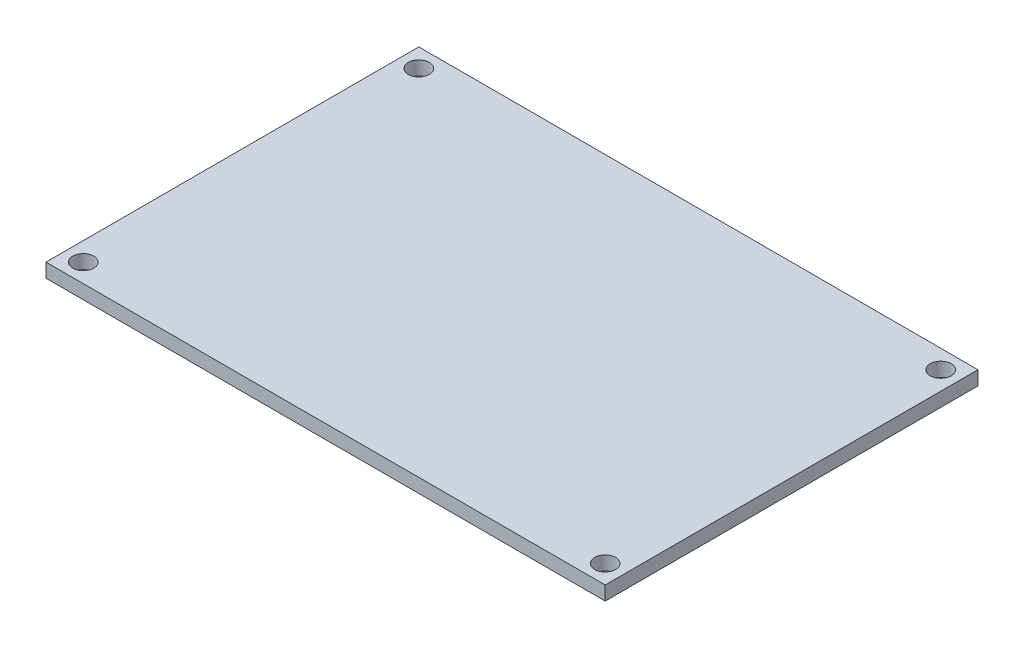
ISO-10303-21;
HEADER;
FILE_DESCRIPTION(('STEP AP214'),'2;1');
FILE_NAME('part.step','',(''),(''),'','','');
FILE_SCHEMA(('AUTOMOTIVE_DESIGN { 1 0 10303 214 1 1 1 1 }'));
ENDSEC;
DATA;
#1=APPLICATION_CONTEXT('core data for automotive mechanical design processes');
#2=APPLICATION_PROTOCOL_DEFINITION('international standard','automotive_design',2000,#1);
#3=PRODUCT_CONTEXT('',#1,'mechanical');
#4=PRODUCT('Part','Part','',(#3));
#5=PRODUCT_RELATED_PRODUCT_CATEGORY('part','',(#4));
#6=PRODUCT_DEFINITION_FORMATION('','',#4);
#7=PRODUCT_DEFINITION_CONTEXT('part definition',#1,'design');
#8=PRODUCT_DEFINITION('design','',#6,#7);
#9=PRODUCT_DEFINITION_SHAPE('','',#8);
#10=(LENGTH_UNIT() NAMED_UNIT(*) SI_UNIT(.MILLI.,.METRE.));
#11=(NAMED_UNIT(*) PLANE_ANGLE_UNIT() SI_UNIT($,.RADIAN.));
#12=(NAMED_UNIT(*) SI_UNIT($,.STERADIAN.) SOLID_ANGLE_UNIT());
#13=UNCERTAINTY_MEASURE_WITH_UNIT(LENGTH_MEASURE(1.E-05),#10,'distance_accuracy_value','');
#14=(GEOMETRIC_REPRESENTATION_CONTEXT(3) GLOBAL_UNCERTAINTY_ASSIGNED_CONTEXT((#13)) GLOBAL_UNIT_ASSIGNED_CONTEXT((#10,
#11,#12)) REPRESENTATION_CONTEXT('',''));
#15=CARTESIAN_POINT('',(0.,0.,0.));
#16=DIRECTION('',(0.,0.,1.));
#17=DIRECTION('',(1.,0.,0.));
#18=AXIS2_PLACEMENT_3D('',#15,#16,#17);
#19=CARTESIAN_POINT('',(0.,1.5,0.));
#20=DIRECTION('',(0.,1.,0.));
#21=DIRECTION('',(0.,0.,1.));
#22=AXIS2_PLACEMENT_3D('',#19,#20,#21);
#23=PLANE('',#22);
#24=CARTESIAN_POINT('',(28.0000000000004,1.5,18.));
#25=DIRECTION('',(0.,1.,0.));
#26=DIRECTION('',(0.,0.,1.));
#27=AXIS2_PLACEMENT_3D('',#24,#25,#26);
#28=CIRCLE('',#27,1.125);
#29=CARTESIAN_POINT('',(28.0000000000004,1.5,19.125));
#30=VERTEX_POINT('',#29);
#31=EDGE_CURVE('E142',#30,#30,#28,.T.);
#32=ORIENTED_EDGE('',*,*,#31,.F.);
#33=EDGE_LOOP('',(#32));
#34=FACE_BOUND('',#33,.T.);
#35=CARTESIAN_POINT('',(-28.,1.5,-18.));
#36=DIRECTION('',(0.,1.,0.));
#37=DIRECTION('',(0.,0.,1.));
#38=AXIS2_PLACEMENT_3D('',#35,#36,#37);
#39=CIRCLE('',#38,1.125);
#40=CARTESIAN_POINT('',(-28.,1.5,-16.875));
#41=VERTEX_POINT('',#40);
#42=EDGE_CURVE('E112',#41,#41,#39,.T.);
#43=ORIENTED_EDGE('',*,*,#42,.F.);
#44=EDGE_LOOP('',(#43));
#45=FACE_BOUND('',#44,.T.);
#46=DIRECTION('',(0.,0.,-1.));
#47=VECTOR('',#46,1.);
#48=CARTESIAN_POINT('',(30.,1.5,-20.));
#49=LINE('',#48,#47);
#50=CARTESIAN_POINT('',(30.,1.5,20.));
#51=VERTEX_POINT('',#50);
#52=CARTESIAN_POINT('',(30.,1.5,-20.));
#53=VERTEX_POINT('',#52);
#54=EDGE_CURVE('E92',#51,#53,#49,.T.);
#55=ORIENTED_EDGE('',*,*,#54,.T.);
#56=DIRECTION('',(-1.,0.,0.));
#57=VECTOR('',#56,1.);
#58=CARTESIAN_POINT('',(-30.,1.5,-20.));
#59=LINE('',#58,#57);
#60=CARTESIAN_POINT('',(-30.,1.5,-20.));
#61=VERTEX_POINT('',#60);
#62=EDGE_CURVE('E87',#53,#61,#59,.T.);
#63=ORIENTED_EDGE('',*,*,#62,.T.);
#64=DIRECTION('',(0.,0.,1.));
#65=VECTOR('',#64,1.);
#66=CARTESIAN_POINT('',(-30.,1.5,-20.));
#67=LINE('',#66,#65);
#68=CARTESIAN_POINT('',(-30.,1.5,20.));
#69=VERTEX_POINT('',#68);
#70=EDGE_CURVE('E90',#61,#69,#67,.T.);
#71=ORIENTED_EDGE('',*,*,#70,.T.);
#72=DIRECTION('',(1.,0.,0.));
#73=VECTOR('',#72,1.);
#74=CARTESIAN_POINT('',(-30.,1.5,20.));
#75=LINE('',#74,#73);
#76=EDGE_CURVE('E57',#69,#51,#75,.T.);
#77=ORIENTED_EDGE('',*,*,#76,.T.);
#78=EDGE_LOOP('',(#55,#63,#71,#77));
#79=FACE_BOUND('',#78,.T.);
#80=CARTESIAN_POINT('',(28.,1.5,-18.));
#81=DIRECTION('',(0.,1.,0.));
#82=DIRECTION('',(0.,0.,1.));
#83=AXIS2_PLACEMENT_3D('',#80,#81,#82);
#84=CIRCLE('',#83,1.125);
#85=CARTESIAN_POINT('',(28.,1.5,-16.875));
#86=VERTEX_POINT('',#85);
#87=EDGE_CURVE('E134',#86,#86,#84,.T.);
#88=ORIENTED_EDGE('',*,*,#87,.F.);
#89=EDGE_LOOP('',(#88));
#90=FACE_BOUND('',#89,.T.);
#91=CARTESIAN_POINT('',(-27.9999999999996,1.5,18.));
#92=DIRECTION('',(0.,1.,0.));
#93=DIRECTION('',(0.,0.,1.));
#94=AXIS2_PLACEMENT_3D('',#91,#92,#93);
#95=CIRCLE('',#94,1.125);
#96=CARTESIAN_POINT('',(-27.9999999999996,1.5,19.125));
#97=VERTEX_POINT('',#96);
#98=EDGE_CURVE('E150',#97,#97,#95,.T.);
#99=ORIENTED_EDGE('',*,*,#98,.F.);
#100=EDGE_LOOP('',(#99));
#101=FACE_BOUND('',#100,.T.);
#102=ADVANCED_FACE('F39',(#34,#45,#79,#90,#101),#23,.T.);
#103=CARTESIAN_POINT('',(0.,0.,0.));
#104=DIRECTION('',(0.,1.,0.));
#105=DIRECTION('',(0.,0.,1.));
#106=AXIS2_PLACEMENT_3D('',#103,#104,#105);
#107=PLANE('',#106);
#108=DIRECTION('',(0.,0.,-1.));
#109=VECTOR('',#108,1.);
#110=CARTESIAN_POINT('',(30.,0.,-20.));
#111=LINE('',#110,#109);
#112=CARTESIAN_POINT('',(30.,0.,20.));
#113=VERTEX_POINT('',#112);
#114=CARTESIAN_POINT('',(30.,0.,-20.));
#115=VERTEX_POINT('',#114);
#116=EDGE_CURVE('E108',#113,#115,#111,.T.);
#117=ORIENTED_EDGE('',*,*,#116,.F.);
#118=DIRECTION('',(1.,0.,0.));
#119=VECTOR('',#118,1.);
#120=CARTESIAN_POINT('',(-30.,0.,20.));
#121=LINE('',#120,#119);
#122=CARTESIAN_POINT('',(-30.,0.,20.));
#123=VERTEX_POINT('',#122);
#124=EDGE_CURVE('E80',#123,#113,#121,.T.);
#125=ORIENTED_EDGE('',*,*,#124,.F.);
#126=DIRECTION('',(0.,0.,1.));
#127=VECTOR('',#126,1.);
#128=CARTESIAN_POINT('',(-30.,0.,-20.));
#129=LINE('',#128,#127);
#130=CARTESIAN_POINT('',(-30.,0.,-20.));
#131=VERTEX_POINT('',#130);
#132=EDGE_CURVE('E74',#131,#123,#129,.T.);
#133=ORIENTED_EDGE('',*,*,#132,.F.);
#134=DIRECTION('',(-1.,0.,0.));
#135=VECTOR('',#134,1.);
#136=CARTESIAN_POINT('',(-30.,0.,-20.));
#137=LINE('',#136,#135);
#138=EDGE_CURVE('E97',#115,#131,#137,.T.);
#139=ORIENTED_EDGE('',*,*,#138,.F.);
#140=EDGE_LOOP('',(#117,#125,#133,#139));
#141=FACE_BOUND('',#140,.T.);
#142=CARTESIAN_POINT('',(-28.,0.,-18.));
#143=DIRECTION('',(0.,1.,0.));
#144=DIRECTION('',(0.,0.,1.));
#145=AXIS2_PLACEMENT_3D('',#142,#143,#144);
#146=CIRCLE('',#145,1.125);
#147=CARTESIAN_POINT('',(-28.,0.,-16.875));
#148=VERTEX_POINT('',#147);
#149=EDGE_CURVE('E130',#148,#148,#146,.T.);
#150=ORIENTED_EDGE('',*,*,#149,.T.);
#151=EDGE_LOOP('',(#150));
#152=FACE_BOUND('',#151,.T.);
#153=CARTESIAN_POINT('',(28.,0.,-18.));
#154=DIRECTION('',(0.,1.,0.));
#155=DIRECTION('',(0.,0.,1.));
#156=AXIS2_PLACEMENT_3D('',#153,#154,#155);
#157=CIRCLE('',#156,1.125);
#158=CARTESIAN_POINT('',(28.,0.,-16.875));
#159=VERTEX_POINT('',#158);
#160=EDGE_CURVE('E138',#159,#159,#157,.T.);
#161=ORIENTED_EDGE('',*,*,#160,.T.);
#162=EDGE_LOOP('',(#161));
#163=FACE_BOUND('',#162,.T.);
#164=CARTESIAN_POINT('',(28.0000000000004,0.,18.));
#165=DIRECTION('',(0.,1.,0.));
#166=DIRECTION('',(0.,0.,1.));
#167=AXIS2_PLACEMENT_3D('',#164,#165,#166);
#168=CIRCLE('',#167,1.125);
#169=CARTESIAN_POINT('',(28.0000000000004,0.,19.125));
#170=VERTEX_POINT('',#169);
#171=EDGE_CURVE('E146',#170,#170,#168,.T.);
#172=ORIENTED_EDGE('',*,*,#171,.T.);
#173=EDGE_LOOP('',(#172));
#174=FACE_BOUND('',#173,.T.);
#175=CARTESIAN_POINT('',(-27.9999999999996,0.,18.));
#176=DIRECTION('',(0.,1.,0.));
#177=DIRECTION('',(0.,0.,1.));
#178=AXIS2_PLACEMENT_3D('',#175,#176,#177);
#179=CIRCLE('',#178,1.125);
#180=CARTESIAN_POINT('',(-27.9999999999996,0.,19.125));
#181=VERTEX_POINT('',#180);
#182=EDGE_CURVE('E154',#181,#181,#179,.T.);
#183=ORIENTED_EDGE('',*,*,#182,.T.);
#184=EDGE_LOOP('',(#183));
#185=FACE_BOUND('',#184,.T.);
#186=ADVANCED_FACE('F125',(#141,#152,#163,#174,#185),#107,.F.);
#187=CARTESIAN_POINT('',(30.,1.5,-20.));
#188=DIRECTION('',(-1.,0.,0.));
#189=DIRECTION('',(0.,0.,1.));
#190=AXIS2_PLACEMENT_3D('',#187,#188,#189);
#191=PLANE('',#190);
#192=ORIENTED_EDGE('',*,*,#116,.T.);
#193=DIRECTION('',(0.,-1.,0.));
#194=VECTOR('',#193,1.);
#195=CARTESIAN_POINT('',(30.,1.5,-20.));
#196=LINE('',#195,#194);
#197=EDGE_CURVE('E11',#53,#115,#196,.T.);
#198=ORIENTED_EDGE('',*,*,#197,.F.);
#199=ORIENTED_EDGE('',*,*,#54,.F.);
#200=DIRECTION('',(0.,-1.,0.));
#201=VECTOR('',#200,1.);
#202=CARTESIAN_POINT('',(30.,1.5,20.));
#203=LINE('',#202,#201);
#204=EDGE_CURVE('E104',#51,#113,#203,.T.);
#205=ORIENTED_EDGE('',*,*,#204,.T.);
#206=EDGE_LOOP('',(#192,#198,#199,#205));
#207=FACE_BOUND('',#206,.T.);
#208=ADVANCED_FACE('F41',(#207),#191,.F.);
#209=CARTESIAN_POINT('',(-30.,1.5,-20.));
#210=DIRECTION('',(0.,0.,1.));
#211=DIRECTION('',(1.,0.,0.));
#212=AXIS2_PLACEMENT_3D('',#209,#210,#211);
#213=PLANE('',#212);
#214=ORIENTED_EDGE('',*,*,#138,.T.);
#215=DIRECTION('',(0.,-1.,0.));
#216=VECTOR('',#215,1.);
#217=CARTESIAN_POINT('',(-30.,1.5,-20.));
#218=LINE('',#217,#216);
#219=EDGE_CURVE('E49',#61,#131,#218,.T.);
#220=ORIENTED_EDGE('',*,*,#219,.F.);
#221=ORIENTED_EDGE('',*,*,#62,.F.);
#222=ORIENTED_EDGE('',*,*,#197,.T.);
#223=EDGE_LOOP('',(#214,#220,#221,#222));
#224=FACE_BOUND('',#223,.T.);
#225=ADVANCED_FACE('F96',(#224),#213,.F.);
#226=CARTESIAN_POINT('',(-30.,1.5,-20.));
#227=DIRECTION('',(1.,0.,0.));
#228=DIRECTION('',(0.,0.,-1.));
#229=AXIS2_PLACEMENT_3D('',#226,#227,#228);
#230=PLANE('',#229);
#231=ORIENTED_EDGE('',*,*,#132,.T.);
#232=DIRECTION('',(0.,-1.,0.));
#233=VECTOR('',#232,1.);
#234=CARTESIAN_POINT('',(-30.,1.5,20.));
#235=LINE('',#234,#233);
#236=EDGE_CURVE('E99',#69,#123,#235,.T.);
#237=ORIENTED_EDGE('',*,*,#236,.F.);
#238=ORIENTED_EDGE('',*,*,#70,.F.);
#239=ORIENTED_EDGE('',*,*,#219,.T.);
#240=EDGE_LOOP('',(#231,#237,#238,#239));
#241=FACE_BOUND('',#240,.T.);
#242=ADVANCED_FACE('F100',(#241),#230,.F.);
#243=CARTESIAN_POINT('',(-30.,1.5,20.));
#244=DIRECTION('',(0.,0.,-1.));
#245=DIRECTION('',(-1.,0.,0.));
#246=AXIS2_PLACEMENT_3D('',#243,#244,#245);
#247=PLANE('',#246);
#248=ORIENTED_EDGE('',*,*,#124,.T.);
#249=ORIENTED_EDGE('',*,*,#204,.F.);
#250=ORIENTED_EDGE('',*,*,#76,.F.);
#251=ORIENTED_EDGE('',*,*,#236,.T.);
#252=EDGE_LOOP('',(#248,#249,#250,#251));
#253=FACE_BOUND('',#252,.T.);
#254=ADVANCED_FACE('F122',(#253),#247,.F.);
#255=CARTESIAN_POINT('',(-28.,1.5,-18.));
#256=DIRECTION('',(0.,-1.,0.));
#257=DIRECTION('',(0.,0.,-1.));
#258=AXIS2_PLACEMENT_3D('',#255,#256,#257);
#259=CYLINDRICAL_SURFACE('',#258,1.125);
#260=ORIENTED_EDGE('',*,*,#42,.T.);
#261=EDGE_LOOP('',(#260));
#262=FACE_BOUND('',#261,.T.);
#263=ORIENTED_EDGE('',*,*,#149,.F.);
#264=EDGE_LOOP('',(#263));
#265=FACE_BOUND('',#264,.T.);
#266=ADVANCED_FACE('F175',(#262,#265),#259,.F.);
#267=CARTESIAN_POINT('',(28.,1.5,-18.));
#268=DIRECTION('',(0.,-1.,0.));
#269=DIRECTION('',(0.,0.,-1.));
#270=AXIS2_PLACEMENT_3D('',#267,#268,#269);
#271=CYLINDRICAL_SURFACE('',#270,1.125);
#272=ORIENTED_EDGE('',*,*,#87,.T.);
#273=EDGE_LOOP('',(#272));
#274=FACE_BOUND('',#273,.T.);
#275=ORIENTED_EDGE('',*,*,#160,.F.);
#276=EDGE_LOOP('',(#275));
#277=FACE_BOUND('',#276,.T.);
#278=ADVANCED_FACE('F221',(#274,#277),#271,.F.);
#279=CARTESIAN_POINT('',(28.0000000000004,1.5,18.));
#280=DIRECTION('',(0.,-1.,0.));
#281=DIRECTION('',(0.,0.,-1.));
#282=AXIS2_PLACEMENT_3D('',#279,#280,#281);
#283=CYLINDRICAL_SURFACE('',#282,1.125);
#284=ORIENTED_EDGE('',*,*,#31,.T.);
#285=EDGE_LOOP('',(#284));
#286=FACE_BOUND('',#285,.T.);
#287=ORIENTED_EDGE('',*,*,#171,.F.);
#288=EDGE_LOOP('',(#287));
#289=FACE_BOUND('',#288,.T.);
#290=ADVANCED_FACE('F229',(#286,#289),#283,.F.);
#291=CARTESIAN_POINT('',(-27.9999999999996,1.5,18.));
#292=DIRECTION('',(0.,-1.,0.));
#293=DIRECTION('',(0.,0.,-1.));
#294=AXIS2_PLACEMENT_3D('',#291,#292,#293);
#295=CYLINDRICAL_SURFACE('',#294,1.125);
#296=ORIENTED_EDGE('',*,*,#98,.T.);
#297=EDGE_LOOP('',(#296));
#298=FACE_BOUND('',#297,.T.);
#299=ORIENTED_EDGE('',*,*,#182,.F.);
#300=EDGE_LOOP('',(#299));
#301=FACE_BOUND('',#300,.T.);
#302=ADVANCED_FACE('F162',(#298,#301),#295,.F.);
#303=CLOSED_SHELL('',(#102,#186,#208,#225,#242,#254,#266,#278,#290,#302));
#304=MANIFOLD_SOLID_BREP('B2',#303);
#305=ADVANCED_BREP_SHAPE_REPRESENTATION('',(#18,#304),#14);
#306=SHAPE_DEFINITION_REPRESENTATION(#9,#305);
ENDSEC;
END-ISO-10303-21;
